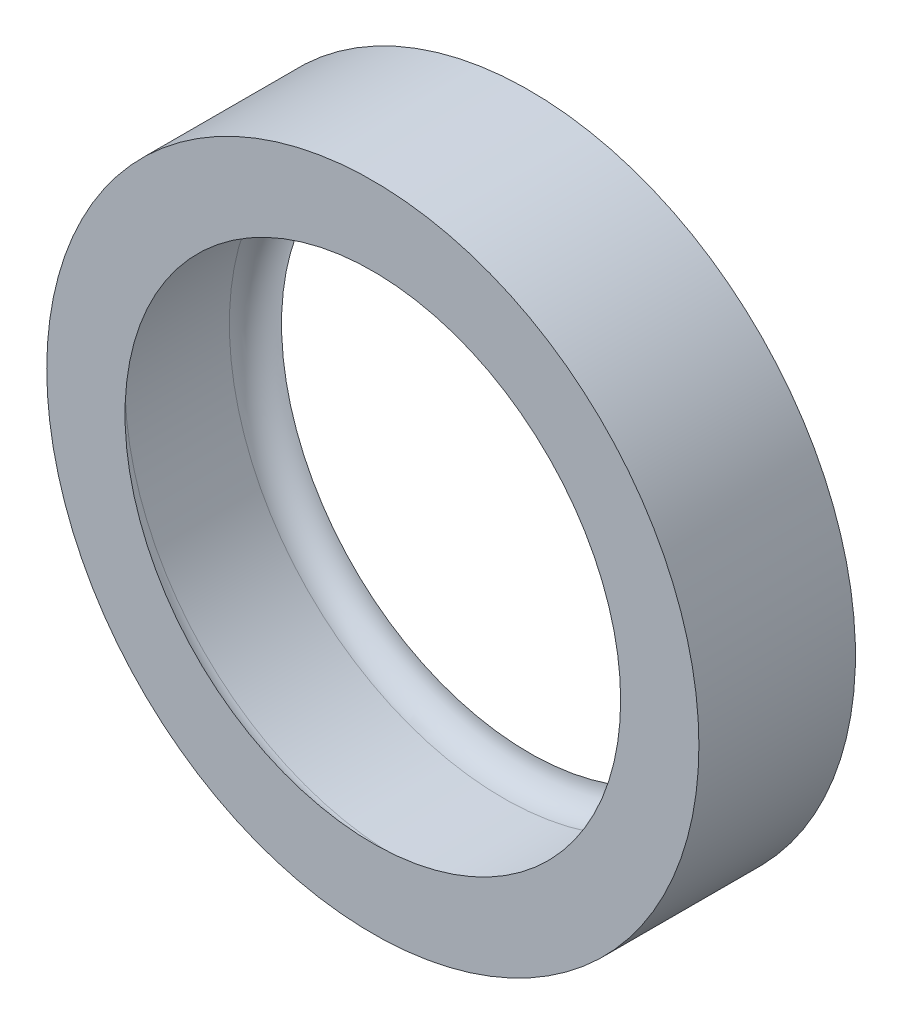
ISO-10303-21;
HEADER;
FILE_DESCRIPTION(('STEP AP214'),'2;1');
FILE_NAME('part.step','',(''),(''),'','','');
FILE_SCHEMA(('AUTOMOTIVE_DESIGN { 1 0 10303 214 1 1 1 1 }'));
ENDSEC;
DATA;
#1=APPLICATION_CONTEXT('core data for automotive mechanical design processes');
#2=APPLICATION_PROTOCOL_DEFINITION('international standard','automotive_design',2000,#1);
#3=PRODUCT_CONTEXT('',#1,'mechanical');
#4=PRODUCT('Part','Part','',(#3));
#5=PRODUCT_RELATED_PRODUCT_CATEGORY('part','',(#4));
#6=PRODUCT_DEFINITION_FORMATION('','',#4);
#7=PRODUCT_DEFINITION_CONTEXT('part definition',#1,'design');
#8=PRODUCT_DEFINITION('design','',#6,#7);
#9=PRODUCT_DEFINITION_SHAPE('','',#8);
#10=(LENGTH_UNIT() NAMED_UNIT(*) SI_UNIT(.MILLI.,.METRE.));
#11=(NAMED_UNIT(*) PLANE_ANGLE_UNIT() SI_UNIT($,.RADIAN.));
#12=(NAMED_UNIT(*) SI_UNIT($,.STERADIAN.) SOLID_ANGLE_UNIT());
#13=UNCERTAINTY_MEASURE_WITH_UNIT(LENGTH_MEASURE(1.E-05),#10,'distance_accuracy_value','');
#14=(GEOMETRIC_REPRESENTATION_CONTEXT(3) GLOBAL_UNCERTAINTY_ASSIGNED_CONTEXT((#13)) GLOBAL_UNIT_ASSIGNED_CONTEXT((#10,
#11,#12)) REPRESENTATION_CONTEXT('',''));
#15=CARTESIAN_POINT('',(0.,0.,0.));
#16=DIRECTION('',(0.,0.,1.));
#17=DIRECTION('',(1.,0.,0.));
#18=AXIS2_PLACEMENT_3D('',#15,#16,#17);
#19=CARTESIAN_POINT('',(0.,0.,41.3553390593274));
#20=DIRECTION('',(0.,0.,-1.));
#21=DIRECTION('',(-1.,0.,0.));
#22=AXIS2_PLACEMENT_3D('',#19,#20,#21);
#23=CYLINDRICAL_SURFACE('',#22,12.5);
#24=CARTESIAN_POINT('',(0.,0.,0.));
#25=DIRECTION('',(0.,0.,-1.));
#26=DIRECTION('',(-1.,0.,0.));
#27=AXIS2_PLACEMENT_3D('',#24,#25,#26);
#28=CIRCLE('',#27,12.5);
#29=CARTESIAN_POINT('',(-12.5,0.,0.));
#30=VERTEX_POINT('',#29);
#31=EDGE_CURVE('E65',#30,#30,#28,.T.);
#32=ORIENTED_EDGE('',*,*,#31,.F.);
#33=EDGE_LOOP('',(#32));
#34=FACE_BOUND('',#33,.T.);
#35=CARTESIAN_POINT('',(0.,0.,6.));
#36=DIRECTION('',(0.,0.,1.));
#37=DIRECTION('',(1.,0.,0.));
#38=AXIS2_PLACEMENT_3D('',#35,#36,#37);
#39=CIRCLE('',#38,12.5);
#40=CARTESIAN_POINT('',(12.5,0.,6.));
#41=VERTEX_POINT('',#40);
#42=EDGE_CURVE('E69',#41,#41,#39,.F.);
#43=ORIENTED_EDGE('',*,*,#42,.T.);
#44=EDGE_LOOP('',(#43));
#45=FACE_BOUND('',#44,.T.);
#46=ADVANCED_FACE('F41',(#34,#45),#23,.T.);
#47=CARTESIAN_POINT('',(0.,0.,0.));
#48=DIRECTION('',(0.,0.,1.));
#49=DIRECTION('',(1.,0.,0.));
#50=AXIS2_PLACEMENT_3D('',#47,#48,#49);
#51=PLANE('',#50);
#52=CARTESIAN_POINT('',(0.,0.,0.));
#53=DIRECTION('',(0.,0.,1.));
#54=DIRECTION('',(1.,0.,0.));
#55=AXIS2_PLACEMENT_3D('',#52,#53,#54);
#56=CIRCLE('',#55,9.5);
#57=CARTESIAN_POINT('',(9.5,0.,0.));
#58=VERTEX_POINT('',#57);
#59=EDGE_CURVE('E60',#58,#58,#56,.F.);
#60=ORIENTED_EDGE('',*,*,#59,.F.);
#61=EDGE_LOOP('',(#60));
#62=FACE_BOUND('',#61,.T.);
#63=ORIENTED_EDGE('',*,*,#31,.T.);
#64=EDGE_LOOP('',(#63));
#65=FACE_BOUND('',#64,.T.);
#66=ADVANCED_FACE('F43',(#62,#65),#51,.F.);
#67=CARTESIAN_POINT('',(0.,0.,6.));
#68=DIRECTION('',(0.,0.,1.));
#69=DIRECTION('',(1.,0.,0.));
#70=AXIS2_PLACEMENT_3D('',#67,#68,#69);
#71=PLANE('',#70);
#72=CARTESIAN_POINT('',(0.,0.,6.));
#73=DIRECTION('',(0.,0.,1.));
#74=DIRECTION('',(1.,0.,0.));
#75=AXIS2_PLACEMENT_3D('',#72,#73,#74);
#76=CIRCLE('',#75,9.5);
#77=CARTESIAN_POINT('',(9.5,0.,6.));
#78=VERTEX_POINT('',#77);
#79=EDGE_CURVE('E10',#78,#78,#76,.T.);
#80=ORIENTED_EDGE('',*,*,#79,.F.);
#81=EDGE_LOOP('',(#80));
#82=FACE_BOUND('',#81,.T.);
#83=ORIENTED_EDGE('',*,*,#42,.F.);
#84=EDGE_LOOP('',(#83));
#85=FACE_BOUND('',#84,.T.);
#86=ADVANCED_FACE('F75',(#82,#85),#71,.T.);
#87=CARTESIAN_POINT('',(0.,0.,1.));
#88=DIRECTION('',(0.,0.,1.));
#89=DIRECTION('',(1.,0.,0.));
#90=AXIS2_PLACEMENT_3D('',#87,#88,#89);
#91=TOROIDAL_SURFACE('',#90,9.5,1.);
#92=ORIENTED_EDGE('',*,*,#59,.T.);
#93=EDGE_LOOP('',(#92));
#94=FACE_BOUND('',#93,.T.);
#95=CARTESIAN_POINT('',(0.,0.,1.));
#96=DIRECTION('',(0.,0.,1.));
#97=DIRECTION('',(1.,0.,0.));
#98=AXIS2_PLACEMENT_3D('',#95,#96,#97);
#99=CIRCLE('',#98,10.5);
#100=CARTESIAN_POINT('',(10.5,0.,1.));
#101=VERTEX_POINT('',#100);
#102=EDGE_CURVE('E54',#101,#101,#99,.T.);
#103=ORIENTED_EDGE('',*,*,#102,.T.);
#104=EDGE_LOOP('',(#103));
#105=FACE_BOUND('',#104,.T.);
#106=ADVANCED_FACE('F77',(#94,#105),#91,.F.);
#107=CARTESIAN_POINT('',(0.,0.,6.));
#108=DIRECTION('',(0.,0.,-1.));
#109=DIRECTION('',(-1.,0.,0.));
#110=AXIS2_PLACEMENT_3D('',#107,#108,#109);
#111=CYLINDRICAL_SURFACE('',#110,10.5);
#112=CARTESIAN_POINT('',(0.,0.,5.));
#113=DIRECTION('',(0.,0.,1.));
#114=DIRECTION('',(1.,0.,0.));
#115=AXIS2_PLACEMENT_3D('',#112,#113,#114);
#116=CIRCLE('',#115,10.5);
#117=CARTESIAN_POINT('',(10.5,0.,5.));
#118=VERTEX_POINT('',#117);
#119=EDGE_CURVE('E49',#118,#118,#116,.F.);
#120=ORIENTED_EDGE('',*,*,#119,.F.);
#121=EDGE_LOOP('',(#120));
#122=FACE_BOUND('',#121,.T.);
#123=ORIENTED_EDGE('',*,*,#102,.F.);
#124=EDGE_LOOP('',(#123));
#125=FACE_BOUND('',#124,.T.);
#126=ADVANCED_FACE('F83',(#122,#125),#111,.F.);
#127=CARTESIAN_POINT('',(0.,0.,5.));
#128=DIRECTION('',(0.,0.,1.));
#129=DIRECTION('',(1.,0.,0.));
#130=AXIS2_PLACEMENT_3D('',#127,#128,#129);
#131=TOROIDAL_SURFACE('',#130,9.5,1.);
#132=ORIENTED_EDGE('',*,*,#119,.T.);
#133=EDGE_LOOP('',(#132));
#134=FACE_BOUND('',#133,.T.);
#135=ORIENTED_EDGE('',*,*,#79,.T.);
#136=EDGE_LOOP('',(#135));
#137=FACE_BOUND('',#136,.T.);
#138=ADVANCED_FACE('F95',(#134,#137),#131,.F.);
#139=CLOSED_SHELL('',(#46,#66,#86,#106,#126,#138));
#140=MANIFOLD_SOLID_BREP('B2',#139);
#141=ADVANCED_BREP_SHAPE_REPRESENTATION('',(#18,#140),#14);
#142=SHAPE_DEFINITION_REPRESENTATION(#9,#141);
ENDSEC;
END-ISO-10303-21;
